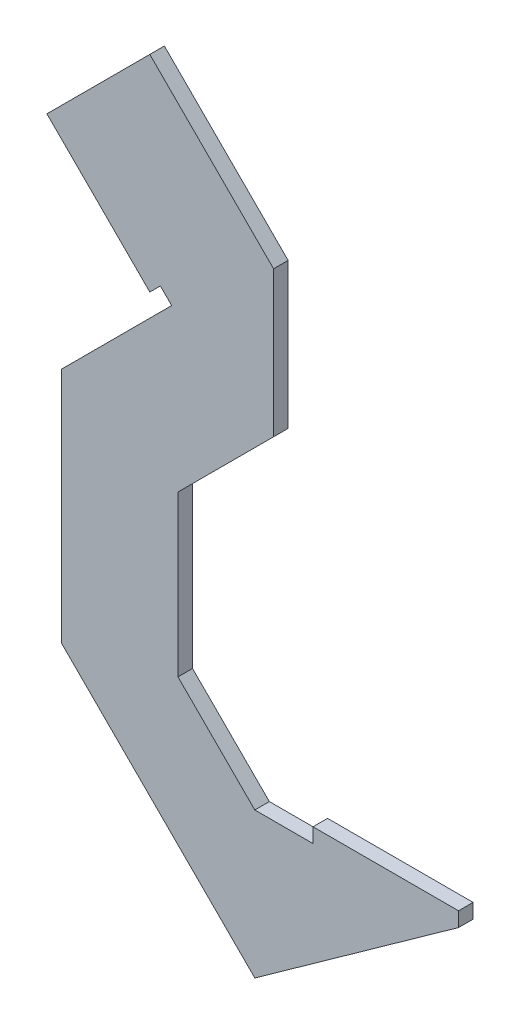
ISO-10303-21;
HEADER;
FILE_DESCRIPTION(('STEP AP214'),'2;1');
FILE_NAME('part.step','',(''),(''),'','','');
FILE_SCHEMA(('AUTOMOTIVE_DESIGN { 1 0 10303 214 1 1 1 1 }'));
ENDSEC;
DATA;
#1=APPLICATION_CONTEXT('core data for automotive mechanical design processes');
#2=APPLICATION_PROTOCOL_DEFINITION('international standard','automotive_design',2000,#1);
#3=PRODUCT_CONTEXT('',#1,'mechanical');
#4=PRODUCT('Part','Part','',(#3));
#5=PRODUCT_RELATED_PRODUCT_CATEGORY('part','',(#4));
#6=PRODUCT_DEFINITION_FORMATION('','',#4);
#7=PRODUCT_DEFINITION_CONTEXT('part definition',#1,'design');
#8=PRODUCT_DEFINITION('design','',#6,#7);
#9=PRODUCT_DEFINITION_SHAPE('','',#8);
#10=(LENGTH_UNIT() NAMED_UNIT(*) SI_UNIT(.MILLI.,.METRE.));
#11=(NAMED_UNIT(*) PLANE_ANGLE_UNIT() SI_UNIT($,.RADIAN.));
#12=(NAMED_UNIT(*) SI_UNIT($,.STERADIAN.) SOLID_ANGLE_UNIT());
#13=UNCERTAINTY_MEASURE_WITH_UNIT(LENGTH_MEASURE(1.E-05),#10,'distance_accuracy_value','');
#14=(GEOMETRIC_REPRESENTATION_CONTEXT(3) GLOBAL_UNCERTAINTY_ASSIGNED_CONTEXT((#13)) GLOBAL_UNIT_ASSIGNED_CONTEXT((#10,
#11,#12)) REPRESENTATION_CONTEXT('',''));
#15=CARTESIAN_POINT('',(0.,0.,0.));
#16=DIRECTION('',(0.,0.,1.));
#17=DIRECTION('',(1.,0.,0.));
#18=AXIS2_PLACEMENT_3D('',#15,#16,#17);
#19=CARTESIAN_POINT('',(-2.72799328977244,1.85957372704414,0.05));
#20=DIRECTION('',(1.,0.,0.));
#21=DIRECTION('',(0.,0.,-1.));
#22=AXIS2_PLACEMENT_3D('',#19,#20,#21);
#23=PLANE('',#22);
#24=DIRECTION('',(0.,-1.,0.));
#25=VECTOR('',#24,1.);
#26=CARTESIAN_POINT('',(-2.72799328977244,1.85957372704414,-0.05));
#27=LINE('',#26,#25);
#28=CARTESIAN_POINT('',(-2.72799328977244,1.85957372704414,-0.05));
#29=VERTEX_POINT('',#28);
#30=CARTESIAN_POINT('',(-2.72799328977244,0.227993289772447,-0.05));
#31=VERTEX_POINT('',#30);
#32=EDGE_CURVE('E194',#29,#31,#27,.T.);
#33=ORIENTED_EDGE('',*,*,#32,.T.);
#34=DIRECTION('',(0.,0.,-1.));
#35=VECTOR('',#34,1.);
#36=CARTESIAN_POINT('',(-2.72799328977244,0.227993289772447,0.05));
#37=LINE('',#36,#35);
#38=CARTESIAN_POINT('',(-2.72799328977244,0.227993289772447,0.05));
#39=VERTEX_POINT('',#38);
#40=EDGE_CURVE('E11',#39,#31,#37,.T.);
#41=ORIENTED_EDGE('',*,*,#40,.F.);
#42=DIRECTION('',(0.,-1.,0.));
#43=VECTOR('',#42,1.);
#44=CARTESIAN_POINT('',(-2.72799328977244,1.85957372704414,0.05));
#45=LINE('',#44,#43);
#46=CARTESIAN_POINT('',(-2.72799328977244,1.85957372704414,0.05));
#47=VERTEX_POINT('',#46);
#48=EDGE_CURVE('E243',#47,#39,#45,.T.);
#49=ORIENTED_EDGE('',*,*,#48,.F.);
#50=DIRECTION('',(0.,0.,-1.));
#51=VECTOR('',#50,1.);
#52=CARTESIAN_POINT('',(-2.72799328977244,1.85957372704414,0.05));
#53=LINE('',#52,#51);
#54=EDGE_CURVE('E190',#47,#29,#53,.T.);
#55=ORIENTED_EDGE('',*,*,#54,.T.);
#56=EDGE_LOOP('',(#33,#41,#49,#55));
#57=FACE_BOUND('',#56,.T.);
#58=ADVANCED_FACE('F39',(#57),#23,.F.);
#59=CARTESIAN_POINT('',(-2.72799328977244,0.227993289772447,0.05));
#60=DIRECTION('',(0.707106781186548,0.707106781186547,0.));
#61=DIRECTION('',(-0.707106781186547,0.707106781186548,0.));
#62=AXIS2_PLACEMENT_3D('',#59,#60,#61);
#63=PLANE('',#62);
#64=DIRECTION('',(0.707106781186547,-0.707106781186548,0.));
#65=VECTOR('',#64,1.);
#66=CARTESIAN_POINT('',(-2.72799328977244,0.227993289772447,-0.05));
#67=LINE('',#66,#65);
#68=CARTESIAN_POINT('',(-1.4,-1.1,-0.05));
#69=VERTEX_POINT('',#68);
#70=EDGE_CURVE('E198',#31,#69,#67,.T.);
#71=ORIENTED_EDGE('',*,*,#70,.T.);
#72=DIRECTION('',(0.,0.,-1.));
#73=VECTOR('',#72,1.);
#74=CARTESIAN_POINT('',(-1.4,-1.1,0.05));
#75=LINE('',#74,#73);
#76=CARTESIAN_POINT('',(-1.4,-1.1,0.05));
#77=VERTEX_POINT('',#76);
#78=EDGE_CURVE('E48',#77,#69,#75,.T.);
#79=ORIENTED_EDGE('',*,*,#78,.F.);
#80=DIRECTION('',(0.707106781186547,-0.707106781186548,0.));
#81=VECTOR('',#80,1.);
#82=CARTESIAN_POINT('',(-2.72799328977244,0.227993289772447,0.05));
#83=LINE('',#82,#81);
#84=EDGE_CURVE('E126',#39,#77,#83,.T.);
#85=ORIENTED_EDGE('',*,*,#84,.F.);
#86=ORIENTED_EDGE('',*,*,#40,.T.);
#87=EDGE_LOOP('',(#71,#79,#85,#86));
#88=FACE_BOUND('',#87,.T.);
#89=ADVANCED_FACE('F372',(#88),#63,.F.);
#90=CARTESIAN_POINT('',(-1.4,-1.1,0.05));
#91=DIRECTION('',(-0.581238193719096,0.813733471206735,0.));
#92=DIRECTION('',(-0.813733471206735,-0.581238193719096,0.));
#93=AXIS2_PLACEMENT_3D('',#90,#91,#92);
#94=PLANE('',#93);
#95=DIRECTION('',(0.813733471206735,0.581238193719096,0.));
#96=VECTOR('',#95,1.);
#97=CARTESIAN_POINT('',(-1.4,-1.1,-0.05));
#98=LINE('',#97,#96);
#99=CARTESIAN_POINT('',(0.,-0.1,-0.05));
#100=VERTEX_POINT('',#99);
#101=EDGE_CURVE('E201',#69,#100,#98,.T.);
#102=ORIENTED_EDGE('',*,*,#101,.T.);
#103=DIRECTION('',(0.,0.,-1.));
#104=VECTOR('',#103,1.);
#105=CARTESIAN_POINT('',(0.,-0.1,0.05));
#106=LINE('',#105,#104);
#107=CARTESIAN_POINT('',(0.,-0.1,0.05));
#108=VERTEX_POINT('',#107);
#109=EDGE_CURVE('E290',#108,#100,#106,.T.);
#110=ORIENTED_EDGE('',*,*,#109,.F.);
#111=DIRECTION('',(0.813733471206735,0.581238193719096,0.));
#112=VECTOR('',#111,1.);
#113=CARTESIAN_POINT('',(-1.4,-1.1,0.05));
#114=LINE('',#113,#112);
#115=EDGE_CURVE('E300',#77,#108,#114,.T.);
#116=ORIENTED_EDGE('',*,*,#115,.F.);
#117=ORIENTED_EDGE('',*,*,#78,.T.);
#118=EDGE_LOOP('',(#102,#110,#116,#117));
#119=FACE_BOUND('',#118,.T.);
#120=ADVANCED_FACE('F298',(#119),#94,.F.);
#121=CARTESIAN_POINT('',(0.,-0.1,0.05));
#122=DIRECTION('',(-1.,0.,0.));
#123=DIRECTION('',(0.,0.,1.));
#124=AXIS2_PLACEMENT_3D('',#121,#122,#123);
#125=PLANE('',#124);
#126=DIRECTION('',(0.,1.,0.));
#127=VECTOR('',#126,1.);
#128=CARTESIAN_POINT('',(0.,-0.1,-0.05));
#129=LINE('',#128,#127);
#130=CARTESIAN_POINT('',(0.,0.,-0.05));
#131=VERTEX_POINT('',#130);
#132=EDGE_CURVE('E204',#100,#131,#129,.T.);
#133=ORIENTED_EDGE('',*,*,#132,.T.);
#134=DIRECTION('',(0.,0.,-1.));
#135=VECTOR('',#134,1.);
#136=CARTESIAN_POINT('',(0.,0.,0.05));
#137=LINE('',#136,#135);
#138=CARTESIAN_POINT('',(0.,0.,0.05));
#139=VERTEX_POINT('',#138);
#140=EDGE_CURVE('E286',#139,#131,#137,.T.);
#141=ORIENTED_EDGE('',*,*,#140,.F.);
#142=DIRECTION('',(0.,1.,0.));
#143=VECTOR('',#142,1.);
#144=CARTESIAN_POINT('',(0.,-0.1,0.05));
#145=LINE('',#144,#143);
#146=EDGE_CURVE('E319',#108,#139,#145,.T.);
#147=ORIENTED_EDGE('',*,*,#146,.F.);
#148=ORIENTED_EDGE('',*,*,#109,.T.);
#149=EDGE_LOOP('',(#133,#141,#147,#148));
#150=FACE_BOUND('',#149,.T.);
#151=ADVANCED_FACE('F309',(#150),#125,.F.);
#152=CARTESIAN_POINT('',(0.,0.,0.05));
#153=DIRECTION('',(0.,-1.,0.));
#154=DIRECTION('',(1.,0.,0.));
#155=AXIS2_PLACEMENT_3D('',#152,#153,#154);
#156=PLANE('',#155);
#157=DIRECTION('',(-1.,0.,0.));
#158=VECTOR('',#157,1.);
#159=CARTESIAN_POINT('',(0.,0.,-0.05));
#160=LINE('',#159,#158);
#161=CARTESIAN_POINT('',(-1.,0.,-0.05));
#162=VERTEX_POINT('',#161);
#163=EDGE_CURVE('E207',#131,#162,#160,.T.);
#164=ORIENTED_EDGE('',*,*,#163,.T.);
#165=DIRECTION('',(0.,0.,-1.));
#166=VECTOR('',#165,1.);
#167=CARTESIAN_POINT('',(-1.,0.,0.05));
#168=LINE('',#167,#166);
#169=CARTESIAN_POINT('',(-1.,0.,0.05));
#170=VERTEX_POINT('',#169);
#171=EDGE_CURVE('E282',#170,#162,#168,.T.);
#172=ORIENTED_EDGE('',*,*,#171,.F.);
#173=DIRECTION('',(-1.,0.,0.));
#174=VECTOR('',#173,1.);
#175=CARTESIAN_POINT('',(0.,0.,0.05));
#176=LINE('',#175,#174);
#177=EDGE_CURVE('E315',#139,#170,#176,.T.);
#178=ORIENTED_EDGE('',*,*,#177,.F.);
#179=ORIENTED_EDGE('',*,*,#140,.T.);
#180=EDGE_LOOP('',(#164,#172,#178,#179));
#181=FACE_BOUND('',#180,.T.);
#182=ADVANCED_FACE('F313',(#181),#156,.F.);
#183=CARTESIAN_POINT('',(-1.,0.,0.05));
#184=DIRECTION('',(1.,0.,0.));
#185=DIRECTION('',(0.,0.,-1.));
#186=AXIS2_PLACEMENT_3D('',#183,#184,#185);
#187=PLANE('',#186);
#188=DIRECTION('',(0.,-1.,0.));
#189=VECTOR('',#188,1.);
#190=CARTESIAN_POINT('',(-1.,0.,-0.05));
#191=LINE('',#190,#189);
#192=CARTESIAN_POINT('',(-1.,-0.1,-0.05));
#193=VERTEX_POINT('',#192);
#194=EDGE_CURVE('E210',#162,#193,#191,.T.);
#195=ORIENTED_EDGE('',*,*,#194,.T.);
#196=DIRECTION('',(0.,0.,-1.));
#197=VECTOR('',#196,1.);
#198=CARTESIAN_POINT('',(-1.,-0.1,0.05));
#199=LINE('',#198,#197);
#200=CARTESIAN_POINT('',(-1.,-0.1,0.05));
#201=VERTEX_POINT('',#200);
#202=EDGE_CURVE('E278',#201,#193,#199,.T.);
#203=ORIENTED_EDGE('',*,*,#202,.F.);
#204=DIRECTION('',(0.,-1.,0.));
#205=VECTOR('',#204,1.);
#206=CARTESIAN_POINT('',(-1.,0.,0.05));
#207=LINE('',#206,#205);
#208=EDGE_CURVE('E318',#170,#201,#207,.T.);
#209=ORIENTED_EDGE('',*,*,#208,.F.);
#210=ORIENTED_EDGE('',*,*,#171,.T.);
#211=EDGE_LOOP('',(#195,#203,#209,#210));
#212=FACE_BOUND('',#211,.T.);
#213=ADVANCED_FACE('F385',(#212),#187,.F.);
#214=CARTESIAN_POINT('',(-1.,-0.1,0.05));
#215=DIRECTION('',(0.,-1.,0.));
#216=DIRECTION('',(1.,0.,0.));
#217=AXIS2_PLACEMENT_3D('',#214,#215,#216);
#218=PLANE('',#217);
#219=DIRECTION('',(-1.,0.,0.));
#220=VECTOR('',#219,1.);
#221=CARTESIAN_POINT('',(-1.,-0.1,-0.05));
#222=LINE('',#221,#220);
#223=CARTESIAN_POINT('',(-1.4,-0.1,-0.05));
#224=VERTEX_POINT('',#223);
#225=EDGE_CURVE('E213',#193,#224,#222,.T.);
#226=ORIENTED_EDGE('',*,*,#225,.T.);
#227=DIRECTION('',(0.,0.,-1.));
#228=VECTOR('',#227,1.);
#229=CARTESIAN_POINT('',(-1.4,-0.1,0.05));
#230=LINE('',#229,#228);
#231=CARTESIAN_POINT('',(-1.4,-0.1,0.05));
#232=VERTEX_POINT('',#231);
#233=EDGE_CURVE('E274',#232,#224,#230,.T.);
#234=ORIENTED_EDGE('',*,*,#233,.F.);
#235=DIRECTION('',(-1.,0.,0.));
#236=VECTOR('',#235,1.);
#237=CARTESIAN_POINT('',(-1.,-0.1,0.05));
#238=LINE('',#237,#236);
#239=EDGE_CURVE('E323',#201,#232,#238,.T.);
#240=ORIENTED_EDGE('',*,*,#239,.F.);
#241=ORIENTED_EDGE('',*,*,#202,.T.);
#242=EDGE_LOOP('',(#226,#234,#240,#241));
#243=FACE_BOUND('',#242,.T.);
#244=ADVANCED_FACE('F388',(#243),#218,.F.);
#245=CARTESIAN_POINT('',(-1.4,-0.1,0.05));
#246=DIRECTION('',(-0.707106781186548,-0.707106781186548,0.));
#247=DIRECTION('',(0.707106781186548,-0.707106781186548,0.));
#248=AXIS2_PLACEMENT_3D('',#245,#246,#247);
#249=PLANE('',#248);
#250=DIRECTION('',(-0.707106781186548,0.707106781186548,0.));
#251=VECTOR('',#250,1.);
#252=CARTESIAN_POINT('',(-1.4,-0.1,-0.05));
#253=LINE('',#252,#251);
#254=CARTESIAN_POINT('',(-1.92799328977244,0.427993289772445,-0.05));
#255=VERTEX_POINT('',#254);
#256=EDGE_CURVE('E216',#224,#255,#253,.T.);
#257=ORIENTED_EDGE('',*,*,#256,.T.);
#258=DIRECTION('',(0.,0.,-1.));
#259=VECTOR('',#258,1.);
#260=CARTESIAN_POINT('',(-1.92799328977244,0.427993289772445,0.05));
#261=LINE('',#260,#259);
#262=CARTESIAN_POINT('',(-1.92799328977244,0.427993289772445,0.05));
#263=VERTEX_POINT('',#262);
#264=EDGE_CURVE('E270',#263,#255,#261,.T.);
#265=ORIENTED_EDGE('',*,*,#264,.F.);
#266=DIRECTION('',(-0.707106781186548,0.707106781186548,0.));
#267=VECTOR('',#266,1.);
#268=CARTESIAN_POINT('',(-1.4,-0.1,0.05));
#269=LINE('',#268,#267);
#270=EDGE_CURVE('E330',#232,#263,#269,.T.);
#271=ORIENTED_EDGE('',*,*,#270,.F.);
#272=ORIENTED_EDGE('',*,*,#233,.T.);
#273=EDGE_LOOP('',(#257,#265,#271,#272));
#274=FACE_BOUND('',#273,.T.);
#275=ADVANCED_FACE('F392',(#274),#249,.F.);
#276=CARTESIAN_POINT('',(-1.92799328977244,0.427993289772445,0.05));
#277=DIRECTION('',(-1.,0.,0.));
#278=DIRECTION('',(0.,0.,1.));
#279=AXIS2_PLACEMENT_3D('',#276,#277,#278);
#280=PLANE('',#279);
#281=DIRECTION('',(0.,1.,0.));
#282=VECTOR('',#281,1.);
#283=CARTESIAN_POINT('',(-1.92799328977244,0.427993289772445,-0.05));
#284=LINE('',#283,#282);
#285=CARTESIAN_POINT('',(-1.92799328977244,1.52820287714566,-0.05));
#286=VERTEX_POINT('',#285);
#287=EDGE_CURVE('E219',#255,#286,#284,.T.);
#288=ORIENTED_EDGE('',*,*,#287,.T.);
#289=DIRECTION('',(0.,0.,-1.));
#290=VECTOR('',#289,1.);
#291=CARTESIAN_POINT('',(-1.92799328977244,1.52820287714566,0.05));
#292=LINE('',#291,#290);
#293=CARTESIAN_POINT('',(-1.92799328977244,1.52820287714566,0.05));
#294=VERTEX_POINT('',#293);
#295=EDGE_CURVE('E266',#294,#286,#292,.T.);
#296=ORIENTED_EDGE('',*,*,#295,.F.);
#297=DIRECTION('',(0.,1.,0.));
#298=VECTOR('',#297,1.);
#299=CARTESIAN_POINT('',(-1.92799328977244,0.427993289772445,0.05));
#300=LINE('',#299,#298);
#301=EDGE_CURVE('E333',#263,#294,#300,.T.);
#302=ORIENTED_EDGE('',*,*,#301,.F.);
#303=ORIENTED_EDGE('',*,*,#264,.T.);
#304=EDGE_LOOP('',(#288,#296,#302,#303));
#305=FACE_BOUND('',#304,.T.);
#306=ADVANCED_FACE('F396',(#305),#280,.F.);
#307=CARTESIAN_POINT('',(-1.92799328977244,1.52820287714566,0.05));
#308=DIRECTION('',(-0.707106781186547,0.707106781186548,0.));
#309=DIRECTION('',(-0.707106781186548,-0.707106781186547,0.));
#310=AXIS2_PLACEMENT_3D('',#307,#308,#309);
#311=PLANE('',#310);
#312=DIRECTION('',(0.707106781186548,0.707106781186547,0.));
#313=VECTOR('',#312,1.);
#314=CARTESIAN_POINT('',(-1.92799328977244,1.52820287714566,-0.05));
#315=LINE('',#314,#313);
#316=CARTESIAN_POINT('',(-1.2709913022725,2.18520486464561,-0.05));
#317=VERTEX_POINT('',#316);
#318=EDGE_CURVE('E222',#286,#317,#315,.T.);
#319=ORIENTED_EDGE('',*,*,#318,.T.);
#320=DIRECTION('',(0.,0.,-1.));
#321=VECTOR('',#320,1.);
#322=CARTESIAN_POINT('',(-1.2709913022725,2.18520486464561,0.05));
#323=LINE('',#322,#321);
#324=CARTESIAN_POINT('',(-1.2709913022725,2.18520486464561,0.05));
#325=VERTEX_POINT('',#324);
#326=EDGE_CURVE('E262',#325,#317,#323,.T.);
#327=ORIENTED_EDGE('',*,*,#326,.F.);
#328=DIRECTION('',(0.707106781186548,0.707106781186547,0.));
#329=VECTOR('',#328,1.);
#330=CARTESIAN_POINT('',(-1.92799328977244,1.52820287714566,0.05));
#331=LINE('',#330,#329);
#332=EDGE_CURVE('E336',#294,#325,#331,.T.);
#333=ORIENTED_EDGE('',*,*,#332,.F.);
#334=ORIENTED_EDGE('',*,*,#295,.T.);
#335=EDGE_LOOP('',(#319,#327,#333,#334));
#336=FACE_BOUND('',#335,.T.);
#337=ADVANCED_FACE('F400',(#336),#311,.F.);
#338=CARTESIAN_POINT('',(-1.2709913022725,2.18520486464561,0.05));
#339=DIRECTION('',(-1.,0.,0.));
#340=DIRECTION('',(0.,-1.,0.));
#341=AXIS2_PLACEMENT_3D('',#338,#339,#340);
#342=PLANE('',#341);
#343=DIRECTION('',(0.,1.,0.));
#344=VECTOR('',#343,1.);
#345=CARTESIAN_POINT('',(-1.2709913022725,2.18520486464561,-0.05));
#346=LINE('',#345,#344);
#347=CARTESIAN_POINT('',(-1.2709913022725,3.18520486464561,-0.05));
#348=VERTEX_POINT('',#347);
#349=EDGE_CURVE('E225',#317,#348,#346,.T.);
#350=ORIENTED_EDGE('',*,*,#349,.T.);
#351=DIRECTION('',(0.,0.,-1.));
#352=VECTOR('',#351,1.);
#353=CARTESIAN_POINT('',(-1.2709913022725,3.18520486464561,0.05));
#354=LINE('',#353,#352);
#355=CARTESIAN_POINT('',(-1.2709913022725,3.18520486464561,0.05));
#356=VERTEX_POINT('',#355);
#357=EDGE_CURVE('E258',#356,#348,#354,.T.);
#358=ORIENTED_EDGE('',*,*,#357,.F.);
#359=DIRECTION('',(0.,1.,0.));
#360=VECTOR('',#359,1.);
#361=CARTESIAN_POINT('',(-1.2709913022725,2.18520486464561,0.05));
#362=LINE('',#361,#360);
#363=EDGE_CURVE('E339',#325,#356,#362,.T.);
#364=ORIENTED_EDGE('',*,*,#363,.F.);
#365=ORIENTED_EDGE('',*,*,#326,.T.);
#366=EDGE_LOOP('',(#350,#358,#364,#365));
#367=FACE_BOUND('',#366,.T.);
#368=ADVANCED_FACE('F404',(#367),#342,.F.);
#369=CARTESIAN_POINT('',(-1.2709913022725,3.18520486464561,0.05));
#370=DIRECTION('',(-0.707106781186548,-0.707106781186547,0.));
#371=DIRECTION('',(0.707106781186547,-0.707106781186548,0.));
#372=AXIS2_PLACEMENT_3D('',#369,#370,#371);
#373=PLANE('',#372);
#374=DIRECTION('',(-0.707106781186547,0.707106781186548,0.));
#375=VECTOR('',#374,1.);
#376=CARTESIAN_POINT('',(-1.2709913022725,3.18520486464561,-0.05));
#377=LINE('',#376,#375);
#378=CARTESIAN_POINT('',(-2.12154208553344,4.03575564790655,-0.05));
#379=VERTEX_POINT('',#378);
#380=EDGE_CURVE('E228',#348,#379,#377,.T.);
#381=ORIENTED_EDGE('',*,*,#380,.T.);
#382=DIRECTION('',(0.,0.,-1.));
#383=VECTOR('',#382,1.);
#384=CARTESIAN_POINT('',(-2.12154208553344,4.03575564790655,0.05));
#385=LINE('',#384,#383);
#386=CARTESIAN_POINT('',(-2.12154208553344,4.03575564790655,0.05));
#387=VERTEX_POINT('',#386);
#388=EDGE_CURVE('E254',#387,#379,#385,.T.);
#389=ORIENTED_EDGE('',*,*,#388,.F.);
#390=DIRECTION('',(-0.707106781186547,0.707106781186548,0.));
#391=VECTOR('',#390,1.);
#392=CARTESIAN_POINT('',(-1.2709913022725,3.18520486464561,0.05));
#393=LINE('',#392,#391);
#394=EDGE_CURVE('E342',#356,#387,#393,.T.);
#395=ORIENTED_EDGE('',*,*,#394,.F.);
#396=ORIENTED_EDGE('',*,*,#357,.T.);
#397=EDGE_LOOP('',(#381,#389,#395,#396));
#398=FACE_BOUND('',#397,.T.);
#399=ADVANCED_FACE('F408',(#398),#373,.F.);
#400=CARTESIAN_POINT('',(-2.12154208553344,4.03575564790655,0.05));
#401=DIRECTION('',(0.707106781186546,-0.707106781186549,0.));
#402=DIRECTION('',(0.707106781186549,0.707106781186546,0.));
#403=AXIS2_PLACEMENT_3D('',#400,#401,#402);
#404=PLANE('',#403);
#405=DIRECTION('',(-0.707106781186549,-0.707106781186546,0.));
#406=VECTOR('',#405,1.);
#407=CARTESIAN_POINT('',(-2.12154208553344,4.03575564790655,-0.05));
#408=LINE('',#407,#406);
#409=CARTESIAN_POINT('',(-2.82864886671999,3.32864886672,-0.05));
#410=VERTEX_POINT('',#409);
#411=EDGE_CURVE('E231',#379,#410,#408,.T.);
#412=ORIENTED_EDGE('',*,*,#411,.T.);
#413=DIRECTION('',(0.,0.,-1.));
#414=VECTOR('',#413,1.);
#415=CARTESIAN_POINT('',(-2.82864886671999,3.32864886672,0.05));
#416=LINE('',#415,#414);
#417=CARTESIAN_POINT('',(-2.82864886671999,3.32864886672,0.05));
#418=VERTEX_POINT('',#417);
#419=EDGE_CURVE('E250',#418,#410,#416,.T.);
#420=ORIENTED_EDGE('',*,*,#419,.F.);
#421=DIRECTION('',(-0.707106781186549,-0.707106781186546,0.));
#422=VECTOR('',#421,1.);
#423=CARTESIAN_POINT('',(-2.12154208553344,4.03575564790655,0.05));
#424=LINE('',#423,#422);
#425=EDGE_CURVE('E345',#387,#418,#424,.T.);
#426=ORIENTED_EDGE('',*,*,#425,.F.);
#427=ORIENTED_EDGE('',*,*,#388,.T.);
#428=EDGE_LOOP('',(#412,#420,#426,#427));
#429=FACE_BOUND('',#428,.T.);
#430=ADVANCED_FACE('F353',(#429),#404,.F.);
#431=CARTESIAN_POINT('',(-2.82864886671999,3.32864886672,0.05));
#432=DIRECTION('',(0.707106781186548,0.707106781186547,0.));
#433=DIRECTION('',(-0.707106781186547,0.707106781186548,0.));
#434=AXIS2_PLACEMENT_3D('',#431,#432,#433);
#435=PLANE('',#434);
#436=DIRECTION('',(0.707106781186547,-0.707106781186548,0.));
#437=VECTOR('',#436,1.);
#438=CARTESIAN_POINT('',(-2.82864886671999,3.32864886672,-0.05));
#439=LINE('',#438,#437);
#440=CARTESIAN_POINT('',(-2.12154208553344,2.62154208553345,-0.05));
#441=VERTEX_POINT('',#440);
#442=EDGE_CURVE('E234',#410,#441,#439,.T.);
#443=ORIENTED_EDGE('',*,*,#442,.T.);
#444=DIRECTION('',(0.,0.,-1.));
#445=VECTOR('',#444,1.);
#446=CARTESIAN_POINT('',(-2.12154208553344,2.62154208553345,0.05));
#447=LINE('',#446,#445);
#448=CARTESIAN_POINT('',(-2.12154208553344,2.62154208553345,0.05));
#449=VERTEX_POINT('',#448);
#450=EDGE_CURVE('E183',#449,#441,#447,.T.);
#451=ORIENTED_EDGE('',*,*,#450,.F.);
#452=DIRECTION('',(0.707106781186547,-0.707106781186548,0.));
#453=VECTOR('',#452,1.);
#454=CARTESIAN_POINT('',(-2.82864886671999,3.32864886672,0.05));
#455=LINE('',#454,#453);
#456=EDGE_CURVE('E172',#418,#449,#455,.T.);
#457=ORIENTED_EDGE('',*,*,#456,.F.);
#458=ORIENTED_EDGE('',*,*,#419,.T.);
#459=EDGE_LOOP('',(#443,#451,#457,#458));
#460=FACE_BOUND('',#459,.T.);
#461=ADVANCED_FACE('F357',(#460),#435,.F.);
#462=CARTESIAN_POINT('',(-2.12154208553344,2.62154208553345,0.05));
#463=DIRECTION('',(-0.707106781186545,0.70710678118655,0.));
#464=DIRECTION('',(-0.70710678118655,-0.707106781186545,0.));
#465=AXIS2_PLACEMENT_3D('',#462,#463,#464);
#466=PLANE('',#465);
#467=DIRECTION('',(0.70710678118655,0.707106781186545,0.));
#468=VECTOR('',#467,1.);
#469=CARTESIAN_POINT('',(-2.12154208553344,2.62154208553345,-0.05));
#470=LINE('',#469,#468);
#471=CARTESIAN_POINT('',(-2.04903816671459,2.6940460043523,-0.05));
#472=VERTEX_POINT('',#471);
#473=EDGE_CURVE('E181',#441,#472,#470,.T.);
#474=ORIENTED_EDGE('',*,*,#473,.T.);
#475=DIRECTION('',(0.,0.,-1.));
#476=VECTOR('',#475,1.);
#477=CARTESIAN_POINT('',(-2.04903816671459,2.6940460043523,0.05));
#478=LINE('',#477,#476);
#479=CARTESIAN_POINT('',(-2.04903816671459,2.6940460043523,0.05));
#480=VERTEX_POINT('',#479);
#481=EDGE_CURVE('E178',#480,#472,#478,.T.);
#482=ORIENTED_EDGE('',*,*,#481,.F.);
#483=DIRECTION('',(0.70710678118655,0.707106781186545,0.));
#484=VECTOR('',#483,1.);
#485=CARTESIAN_POINT('',(-2.12154208553344,2.62154208553345,0.05));
#486=LINE('',#485,#484);
#487=EDGE_CURVE('E166',#449,#480,#486,.T.);
#488=ORIENTED_EDGE('',*,*,#487,.F.);
#489=ORIENTED_EDGE('',*,*,#450,.T.);
#490=EDGE_LOOP('',(#474,#482,#488,#489));
#491=FACE_BOUND('',#490,.T.);
#492=ADVANCED_FACE('F179',(#491),#466,.F.);
#493=CARTESIAN_POINT('',(-2.04903816671459,2.6940460043523,0.05));
#494=DIRECTION('',(0.707106781186553,0.707106781186542,0.));
#495=DIRECTION('',(-0.707106781186542,0.707106781186553,0.));
#496=AXIS2_PLACEMENT_3D('',#493,#494,#495);
#497=PLANE('',#496);
#498=DIRECTION('',(0.707106781186542,-0.707106781186553,0.));
#499=VECTOR('',#498,1.);
#500=CARTESIAN_POINT('',(-2.04903816671459,2.6940460043523,-0.05));
#501=LINE('',#500,#499);
#502=CARTESIAN_POINT('',(-1.97127958958944,2.61628742722714,-0.05));
#503=VERTEX_POINT('',#502);
#504=EDGE_CURVE('E112',#472,#503,#501,.T.);
#505=ORIENTED_EDGE('',*,*,#504,.T.);
#506=DIRECTION('',(0.,0.,-1.));
#507=VECTOR('',#506,1.);
#508=CARTESIAN_POINT('',(-1.97127958958944,2.61628742722714,0.05));
#509=LINE('',#508,#507);
#510=CARTESIAN_POINT('',(-1.97127958958944,2.61628742722714,0.05));
#511=VERTEX_POINT('',#510);
#512=EDGE_CURVE('E184',#511,#503,#509,.T.);
#513=ORIENTED_EDGE('',*,*,#512,.F.);
#514=DIRECTION('',(0.707106781186542,-0.707106781186553,0.));
#515=VECTOR('',#514,1.);
#516=CARTESIAN_POINT('',(-2.04903816671459,2.6940460043523,0.05));
#517=LINE('',#516,#515);
#518=EDGE_CURVE('E170',#480,#511,#517,.T.);
#519=ORIENTED_EDGE('',*,*,#518,.F.);
#520=ORIENTED_EDGE('',*,*,#481,.T.);
#521=EDGE_LOOP('',(#505,#513,#519,#520));
#522=FACE_BOUND('',#521,.T.);
#523=ADVANCED_FACE('F186',(#522),#497,.F.);
#524=CARTESIAN_POINT('',(-1.97127958958944,2.61628742722714,0.05));
#525=DIRECTION('',(0.707106781186548,-0.707106781186548,0.));
#526=DIRECTION('',(0.707106781186548,0.707106781186548,0.));
#527=AXIS2_PLACEMENT_3D('',#524,#525,#526);
#528=PLANE('',#527);
#529=DIRECTION('',(-0.707106781186547,-0.707106781186547,0.));
#530=VECTOR('',#529,1.);
#531=CARTESIAN_POINT('',(-1.97127958958944,2.61628742722714,-0.05));
#532=LINE('',#531,#530);
#533=EDGE_CURVE('E118',#503,#29,#532,.T.);
#534=ORIENTED_EDGE('',*,*,#533,.T.);
#535=ORIENTED_EDGE('',*,*,#54,.F.);
#536=DIRECTION('',(-0.707106781186547,-0.707106781186547,0.));
#537=VECTOR('',#536,1.);
#538=CARTESIAN_POINT('',(-1.97127958958944,2.61628742722714,0.05));
#539=LINE('',#538,#537);
#540=EDGE_CURVE('E56',#511,#47,#539,.T.);
#541=ORIENTED_EDGE('',*,*,#540,.F.);
#542=ORIENTED_EDGE('',*,*,#512,.T.);
#543=EDGE_LOOP('',(#534,#535,#541,#542));
#544=FACE_BOUND('',#543,.T.);
#545=ADVANCED_FACE('F361',(#544),#528,.F.);
#546=CARTESIAN_POINT('',(0.,0.,0.05));
#547=DIRECTION('',(0.,0.,-1.));
#548=DIRECTION('',(-1.,0.,0.));
#549=AXIS2_PLACEMENT_3D('',#546,#547,#548);
#550=PLANE('',#549);
#551=ORIENTED_EDGE('',*,*,#48,.T.);
#552=ORIENTED_EDGE('',*,*,#84,.T.);
#553=ORIENTED_EDGE('',*,*,#115,.T.);
#554=ORIENTED_EDGE('',*,*,#146,.T.);
#555=ORIENTED_EDGE('',*,*,#177,.T.);
#556=ORIENTED_EDGE('',*,*,#208,.T.);
#557=ORIENTED_EDGE('',*,*,#239,.T.);
#558=ORIENTED_EDGE('',*,*,#270,.T.);
#559=ORIENTED_EDGE('',*,*,#301,.T.);
#560=ORIENTED_EDGE('',*,*,#332,.T.);
#561=ORIENTED_EDGE('',*,*,#363,.T.);
#562=ORIENTED_EDGE('',*,*,#394,.T.);
#563=ORIENTED_EDGE('',*,*,#425,.T.);
#564=ORIENTED_EDGE('',*,*,#456,.T.);
#565=ORIENTED_EDGE('',*,*,#487,.T.);
#566=ORIENTED_EDGE('',*,*,#518,.T.);
#567=ORIENTED_EDGE('',*,*,#540,.T.);
#568=EDGE_LOOP('',(#551,#552,#553,#554,#555,#556,#557,#558,#559,#560,#561,#562,#563,#564,#565,
#566,#567));
#569=FACE_BOUND('',#568,.T.);
#570=ADVANCED_FACE('F168',(#569),#550,.F.);
#571=CARTESIAN_POINT('',(0.,0.,-0.05));
#572=DIRECTION('',(0.,0.,-1.));
#573=DIRECTION('',(-1.,0.,0.));
#574=AXIS2_PLACEMENT_3D('',#571,#572,#573);
#575=PLANE('',#574);
#576=ORIENTED_EDGE('',*,*,#32,.F.);
#577=ORIENTED_EDGE('',*,*,#533,.F.);
#578=ORIENTED_EDGE('',*,*,#504,.F.);
#579=ORIENTED_EDGE('',*,*,#473,.F.);
#580=ORIENTED_EDGE('',*,*,#442,.F.);
#581=ORIENTED_EDGE('',*,*,#411,.F.);
#582=ORIENTED_EDGE('',*,*,#380,.F.);
#583=ORIENTED_EDGE('',*,*,#349,.F.);
#584=ORIENTED_EDGE('',*,*,#318,.F.);
#585=ORIENTED_EDGE('',*,*,#287,.F.);
#586=ORIENTED_EDGE('',*,*,#256,.F.);
#587=ORIENTED_EDGE('',*,*,#225,.F.);
#588=ORIENTED_EDGE('',*,*,#194,.F.);
#589=ORIENTED_EDGE('',*,*,#163,.F.);
#590=ORIENTED_EDGE('',*,*,#132,.F.);
#591=ORIENTED_EDGE('',*,*,#101,.F.);
#592=ORIENTED_EDGE('',*,*,#70,.F.);
#593=EDGE_LOOP('',(#576,#577,#578,#579,#580,#581,#582,#583,#584,#585,#586,#587,#588,#589,#590,
#591,#592));
#594=FACE_BOUND('',#593,.T.);
#595=ADVANCED_FACE('F304',(#594),#575,.T.);
#596=CLOSED_SHELL('',(#58,#89,#120,#151,#182,#213,#244,#275,#306,#337,#368,#399,#430,#461,#492,
#523,#545,#570,#595));
#597=MANIFOLD_SOLID_BREP('B2',#596);
#598=ADVANCED_BREP_SHAPE_REPRESENTATION('',(#18,#597),#14);
#599=SHAPE_DEFINITION_REPRESENTATION(#9,#598);
ENDSEC;
END-ISO-10303-21;
